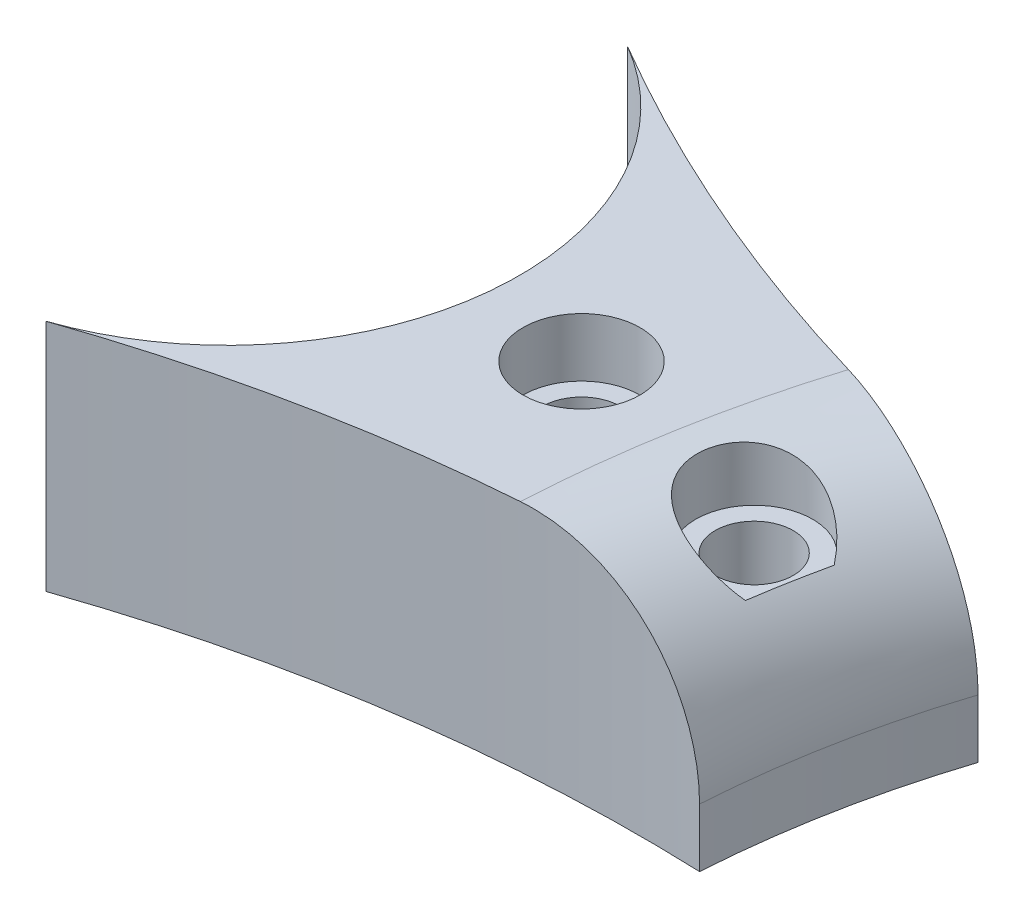
ISO-10303-21;
HEADER;
FILE_DESCRIPTION(('STEP AP214'),'2;1');
FILE_NAME('part.step','',(''),(''),'','','');
FILE_SCHEMA(('AUTOMOTIVE_DESIGN { 1 0 10303 214 1 1 1 1 }'));
ENDSEC;
DATA;
#1=APPLICATION_CONTEXT('core data for automotive mechanical design processes');
#2=APPLICATION_PROTOCOL_DEFINITION('international standard','automotive_design',2000,#1);
#3=PRODUCT_CONTEXT('',#1,'mechanical');
#4=PRODUCT('Part','Part','',(#3));
#5=PRODUCT_RELATED_PRODUCT_CATEGORY('part','',(#4));
#6=PRODUCT_DEFINITION_FORMATION('','',#4);
#7=PRODUCT_DEFINITION_CONTEXT('part definition',#1,'design');
#8=PRODUCT_DEFINITION('design','',#6,#7);
#9=PRODUCT_DEFINITION_SHAPE('','',#8);
#10=(LENGTH_UNIT() NAMED_UNIT(*) SI_UNIT(.MILLI.,.METRE.));
#11=(NAMED_UNIT(*) PLANE_ANGLE_UNIT() SI_UNIT($,.RADIAN.));
#12=(NAMED_UNIT(*) SI_UNIT($,.STERADIAN.) SOLID_ANGLE_UNIT());
#13=UNCERTAINTY_MEASURE_WITH_UNIT(LENGTH_MEASURE(1.E-05),#10,'distance_accuracy_value','');
#14=(GEOMETRIC_REPRESENTATION_CONTEXT(3) GLOBAL_UNCERTAINTY_ASSIGNED_CONTEXT((#13)) GLOBAL_UNIT_ASSIGNED_CONTEXT((#10,
#11,#12)) REPRESENTATION_CONTEXT('',''));
#15=CARTESIAN_POINT('',(0.,0.,0.));
#16=DIRECTION('',(0.,0.,1.));
#17=DIRECTION('',(1.,0.,0.));
#18=AXIS2_PLACEMENT_3D('',#15,#16,#17);
#19=CARTESIAN_POINT('',(-0.236677371726959,12.,1.60597184343372));
#20=DIRECTION('',(0.,-1.,0.));
#21=DIRECTION('',(0.,0.,-1.));
#22=AXIS2_PLACEMENT_3D('',#19,#20,#21);
#23=CYLINDRICAL_SURFACE('',#22,2.);
#24=CARTESIAN_POINT('',(-0.236677371726959,0.,1.60597184343372));
#25=DIRECTION('',(0.,1.,0.));
#26=DIRECTION('',(0.,0.,1.));
#27=AXIS2_PLACEMENT_3D('',#24,#25,#26);
#28=CIRCLE('',#27,2.);
#29=CARTESIAN_POINT('',(-0.236677371726959,0.,3.60597184343373));
#30=VERTEX_POINT('',#29);
#31=EDGE_CURVE('E211',#30,#30,#28,.T.);
#32=ORIENTED_EDGE('',*,*,#31,.F.);
#33=EDGE_LOOP('',(#32));
#34=FACE_BOUND('',#33,.T.);
#35=CARTESIAN_POINT('',(-0.236677371726959,9.,1.60597184343372));
#36=DIRECTION('',(0.,1.,0.));
#37=DIRECTION('',(0.,0.,1.));
#38=AXIS2_PLACEMENT_3D('',#35,#36,#37);
#39=CIRCLE('',#38,2.);
#40=CARTESIAN_POINT('',(-0.236677371726959,9.,3.60597184343373));
#41=VERTEX_POINT('',#40);
#42=EDGE_CURVE('E134',#41,#41,#39,.T.);
#43=ORIENTED_EDGE('',*,*,#42,.T.);
#44=EDGE_LOOP('',(#43));
#45=FACE_BOUND('',#44,.T.);
#46=ADVANCED_FACE('F39',(#34,#45),#23,.F.);
#47=CARTESIAN_POINT('',(9.70418805831716,12.,2.69187906863937));
#48=DIRECTION('',(0.,-1.,0.));
#49=DIRECTION('',(0.,0.,-1.));
#50=AXIS2_PLACEMENT_3D('',#47,#48,#49);
#51=CYLINDRICAL_SURFACE('',#50,2.);
#52=CARTESIAN_POINT('',(9.70418805831716,0.,2.69187906863937));
#53=DIRECTION('',(0.,1.,0.));
#54=DIRECTION('',(0.,0.,1.));
#55=AXIS2_PLACEMENT_3D('',#52,#53,#54);
#56=CIRCLE('',#55,2.);
#57=CARTESIAN_POINT('',(9.70418805831716,0.,4.69187906863937));
#58=VERTEX_POINT('',#57);
#59=EDGE_CURVE('E138',#58,#58,#56,.T.);
#60=ORIENTED_EDGE('',*,*,#59,.F.);
#61=EDGE_LOOP('',(#60));
#62=FACE_BOUND('',#61,.T.);
#63=CARTESIAN_POINT('',(9.70418805831716,9.,2.69187906863937));
#64=DIRECTION('',(0.,1.,0.));
#65=DIRECTION('',(0.,0.,1.));
#66=AXIS2_PLACEMENT_3D('',#63,#64,#65);
#67=CIRCLE('',#66,2.);
#68=CARTESIAN_POINT('',(9.70418805831716,9.,4.69187906863937));
#69=VERTEX_POINT('',#68);
#70=EDGE_CURVE('E130',#69,#69,#67,.T.);
#71=ORIENTED_EDGE('',*,*,#70,.T.);
#72=EDGE_LOOP('',(#71));
#73=FACE_BOUND('',#72,.T.);
#74=ADVANCED_FACE('F184',(#62,#73),#51,.F.);
#75=CARTESIAN_POINT('',(5.9488039499283,12.,-45.8935346301171));
#76=DIRECTION('',(0.,1.,0.));
#77=DIRECTION('',(0.,0.,1.));
#78=AXIS2_PLACEMENT_3D('',#75,#76,#77);
#79=PLANE('',#78);
#80=CARTESIAN_POINT('',(-0.236677371726959,12.,1.60597184343372));
#81=DIRECTION('',(0.,1.,0.));
#82=DIRECTION('',(0.,0.,1.));
#83=AXIS2_PLACEMENT_3D('',#80,#81,#82);
#84=CIRCLE('',#83,3.);
#85=CARTESIAN_POINT('',(-0.236677371726959,12.,4.60597184343372));
#86=VERTEX_POINT('',#85);
#87=EDGE_CURVE('E198',#86,#86,#84,.T.);
#88=ORIENTED_EDGE('',*,*,#87,.F.);
#89=EDGE_LOOP('',(#88));
#90=FACE_BOUND('',#89,.T.);
#91=CARTESIAN_POINT('',(10.3532623870308,12.,89.1808803188708));
#92=DIRECTION('',(0.,-1.,0.));
#93=DIRECTION('',(0.,0.,-1.));
#94=AXIS2_PLACEMENT_3D('',#91,#92,#93);
#95=CIRCLE('',#94,80.);
#96=CARTESIAN_POINT('',(-15.7433670664805,12.,13.5570353282455));
#97=VERTEX_POINT('',#96);
#98=CARTESIAN_POINT('',(4.42791458631752,12.,9.40061801395864));
#99=VERTEX_POINT('',#98);
#100=EDGE_CURVE('E90',#97,#99,#95,.T.);
#101=ORIENTED_EDGE('',*,*,#100,.T.);
#102=CARTESIAN_POINT('',(62.3514658436366,12.,12.3775643925032));
#103=DIRECTION('',(0.,1.,0.));
#104=DIRECTION('',(0.,0.,1.));
#105=AXIS2_PLACEMENT_3D('',#102,#103,#104);
#106=CIRCLE('',#105,58.);
#107=CARTESIAN_POINT('',(6.97531122782223,12.,-4.87008762060925));
#108=VERTEX_POINT('',#107);
#109=EDGE_CURVE('E119',#99,#108,#106,.F.);
#110=ORIENTED_EDGE('',*,*,#109,.T.);
#111=CARTESIAN_POINT('',(32.5340929888705,12.,-91.1646336527375));
#112=DIRECTION('',(0.,-1.,0.));
#113=DIRECTION('',(0.,0.,1.));
#114=AXIS2_PLACEMENT_3D('',#111,#112,#113);
#115=CIRCLE('',#114,90.);
#116=CARTESIAN_POINT('',(-13.0406882207447,12.,-13.5570353282455));
#117=VERTEX_POINT('',#116);
#118=EDGE_CURVE('E103',#108,#117,#115,.T.);
#119=ORIENTED_EDGE('',*,*,#118,.T.);
#120=CARTESIAN_POINT('',(-20.6364850890139,12.,-0.622435607496766));
#121=DIRECTION('',(0.,-1.,0.));
#122=DIRECTION('',(0.,0.,1.));
#123=AXIS2_PLACEMENT_3D('',#120,#121,#122);
#124=CIRCLE('',#123,15.);
#125=EDGE_CURVE('E104',#117,#97,#124,.T.);
#126=ORIENTED_EDGE('',*,*,#125,.T.);
#127=EDGE_LOOP('',(#101,#110,#119,#126));
#128=FACE_BOUND('',#127,.T.);
#129=ADVANCED_FACE('F107',(#90,#128),#79,.T.);
#130=CARTESIAN_POINT('',(5.9488039499283,0.,-45.8935346301171));
#131=DIRECTION('',(0.,1.,0.));
#132=DIRECTION('',(0.,0.,1.));
#133=AXIS2_PLACEMENT_3D('',#130,#131,#132);
#134=PLANE('',#133);
#135=CARTESIAN_POINT('',(-20.6364850890139,0.,-0.622435607496766));
#136=DIRECTION('',(0.,-1.,0.));
#137=DIRECTION('',(0.,0.,1.));
#138=AXIS2_PLACEMENT_3D('',#135,#136,#137);
#139=CIRCLE('',#138,15.);
#140=CARTESIAN_POINT('',(-13.0406882207447,0.,-13.5570353282455));
#141=VERTEX_POINT('',#140);
#142=CARTESIAN_POINT('',(-15.7433670664805,0.,13.5570353282455));
#143=VERTEX_POINT('',#142);
#144=EDGE_CURVE('E117',#141,#143,#139,.T.);
#145=ORIENTED_EDGE('',*,*,#144,.F.);
#146=CARTESIAN_POINT('',(32.5340929888705,0.,-91.1646336527375));
#147=DIRECTION('',(0.,-1.,0.));
#148=DIRECTION('',(0.,0.,1.));
#149=AXIS2_PLACEMENT_3D('',#146,#147,#148);
#150=CIRCLE('',#149,90.);
#151=CARTESIAN_POINT('',(15.7433670664805,0.,-2.74477432804069));
#152=VERTEX_POINT('',#151);
#153=EDGE_CURVE('E113',#152,#141,#150,.T.);
#154=ORIENTED_EDGE('',*,*,#153,.F.);
#155=CARTESIAN_POINT('',(62.3514658436366,0.,12.3775643925032));
#156=DIRECTION('',(0.,-1.,0.));
#157=DIRECTION('',(0.,0.,1.));
#158=AXIS2_PLACEMENT_3D('',#155,#156,#157);
#159=CIRCLE('',#158,49.);
#160=CARTESIAN_POINT('',(13.4519624669639,0.,9.24091498353538));
#161=VERTEX_POINT('',#160);
#162=EDGE_CURVE('E223',#161,#152,#159,.T.);
#163=ORIENTED_EDGE('',*,*,#162,.F.);
#164=CARTESIAN_POINT('',(10.3532623870308,0.,89.1808803188708));
#165=DIRECTION('',(0.,-1.,0.));
#166=DIRECTION('',(0.,0.,-1.));
#167=AXIS2_PLACEMENT_3D('',#164,#165,#166);
#168=CIRCLE('',#167,80.);
#169=EDGE_CURVE('E220',#143,#161,#168,.T.);
#170=ORIENTED_EDGE('',*,*,#169,.F.);
#171=EDGE_LOOP('',(#145,#154,#163,#170));
#172=FACE_BOUND('',#171,.T.);
#173=ORIENTED_EDGE('',*,*,#31,.T.);
#174=EDGE_LOOP('',(#173));
#175=FACE_BOUND('',#174,.T.);
#176=ORIENTED_EDGE('',*,*,#59,.T.);
#177=EDGE_LOOP('',(#176));
#178=FACE_BOUND('',#177,.T.);
#179=ADVANCED_FACE('F157',(#172,#175,#178),#134,.F.);
#180=CARTESIAN_POINT('',(-20.6364850890139,12.,-0.622435607496766));
#181=DIRECTION('',(0.,-1.,0.));
#182=DIRECTION('',(0.,0.,-1.));
#183=AXIS2_PLACEMENT_3D('',#180,#181,#182);
#184=CYLINDRICAL_SURFACE('',#183,15.);
#185=ORIENTED_EDGE('',*,*,#144,.T.);
#186=DIRECTION('',(0.,-1.,0.));
#187=VECTOR('',#186,1.);
#188=CARTESIAN_POINT('',(-15.7433670664805,12.,13.5570353282455));
#189=LINE('',#188,#187);
#190=EDGE_CURVE('E96',#97,#143,#189,.T.);
#191=ORIENTED_EDGE('',*,*,#190,.F.);
#192=ORIENTED_EDGE('',*,*,#125,.F.);
#193=DIRECTION('',(0.,-1.,0.));
#194=VECTOR('',#193,1.);
#195=CARTESIAN_POINT('',(-13.0406882207447,12.,-13.5570353282455));
#196=LINE('',#195,#194);
#197=EDGE_CURVE('E217',#117,#141,#196,.T.);
#198=ORIENTED_EDGE('',*,*,#197,.T.);
#199=EDGE_LOOP('',(#185,#191,#192,#198));
#200=FACE_BOUND('',#199,.T.);
#201=ADVANCED_FACE('F115',(#200),#184,.F.);
#202=CARTESIAN_POINT('',(10.3532623870308,12.,89.1808803188708));
#203=DIRECTION('',(0.,-1.,0.));
#204=DIRECTION('',(0.,0.,-1.));
#205=AXIS2_PLACEMENT_3D('',#202,#203,#204);
#206=CYLINDRICAL_SURFACE('',#205,80.);
#207=DIRECTION('',(0.,-1.,0.));
#208=VECTOR('',#207,1.);
#209=CARTESIAN_POINT('',(13.4519624669639,12.,9.24091498353538));
#210=LINE('',#209,#208);
#211=CARTESIAN_POINT('',(13.4519624669639,3.,9.24091498353538));
#212=VERTEX_POINT('',#211);
#213=EDGE_CURVE('E120',#212,#161,#210,.T.);
#214=ORIENTED_EDGE('',*,*,#213,.F.);
#215=CARTESIAN_POINT('',(13.4519624669639,3.,9.24091498353538));
#216=CARTESIAN_POINT('',(13.4519891234085,3.25297233153846,9.24092505882907));
#217=CARTESIAN_POINT('',(13.4413023460074,3.50594085709848,9.24050205118857));
#218=CARTESIAN_POINT('',(13.3986943509752,4.01006962786932,9.23886267545259));
#219=CARTESIAN_POINT('',(13.3667741036326,4.2612299551778,9.23764634360905));
#220=CARTESIAN_POINT('',(13.2819221523991,4.75978537877782,9.23449424881869));
#221=CARTESIAN_POINT('',(13.2290056087375,5.00718305832853,9.23255900502138));
#222=CARTESIAN_POINT('',(13.1025391292607,5.49663839930236,9.22810985900771));
#223=CARTESIAN_POINT('',(13.0289894544465,5.738696128232,9.22559596411112));
#224=CARTESIAN_POINT('',(12.8617269213555,6.2158721499899,9.22017373643613));
#225=CARTESIAN_POINT('',(12.7680041170434,6.4509869544613,9.21726520935312));
#226=CARTESIAN_POINT('',(12.5610728984253,6.91248301731586,9.21128433454328));
#227=CARTESIAN_POINT('',(12.4478640899602,7.13886409892163,9.20821198350352));
#228=CARTESIAN_POINT('',(12.2027825485956,7.58123279052617,9.20216884549149));
#229=CARTESIAN_POINT('',(12.0709133626762,7.79722236532019,9.19919803935042));
#230=CARTESIAN_POINT('',(11.7894280466629,8.21731375531125,9.19364861622804));
#231=CARTESIAN_POINT('',(11.6398120254271,8.42141564341526,9.19106999684131));
#232=CARTESIAN_POINT('',(11.3240080437077,8.81613795469398,9.18661450212595));
#233=CARTESIAN_POINT('',(11.1578319731109,9.00676788484916,9.18473712784646));
#234=CARTESIAN_POINT('',(10.810004061663,9.37335116934798,9.18199516866419));
#235=CARTESIAN_POINT('',(10.6283522443142,9.54930454597946,9.18113058222335));
#236=CARTESIAN_POINT('',(10.2508447194019,9.88531421402111,9.18072322952118));
#237=CARTESIAN_POINT('',(10.0549868060684,10.0453680275366,9.18118066895999));
#238=CARTESIAN_POINT('',(9.65050509402783,10.3484165732581,9.18371145821867));
#239=CARTESIAN_POINT('',(9.44188149745772,10.4914115754745,9.18578478245807));
#240=CARTESIAN_POINT('',(9.01365761207381,10.7591671085883,9.19181081496272));
#241=CARTESIAN_POINT('',(8.7940723685374,10.8839517579601,9.1957610073555));
#242=CARTESIAN_POINT('',(8.3452584685421,11.1146547512669,9.20576979990807));
#243=CARTESIAN_POINT('',(8.11602995244269,11.2205733696829,9.21182836938941));
#244=CARTESIAN_POINT('',(7.64964888235126,11.4128005176619,9.2262378343115));
#245=CARTESIAN_POINT('',(7.41249918198665,11.499116023733,9.23458791188883));
#246=CARTESIAN_POINT('',(6.93200263272246,11.6516018364655,9.25370818642899));
#247=CARTESIAN_POINT('',(6.68865719373709,11.71777668275,9.26447783707724));
#248=CARTESIAN_POINT('',(6.11228239886847,11.8489561497775,9.29268705958484));
#249=CARTESIAN_POINT('',(5.77735060508964,11.9056361580635,9.31114516588176));
#250=CARTESIAN_POINT('',(5.27242675315383,11.9622717905799,9.34220778177838));
#251=CARTESIAN_POINT('',(5.10378689990107,11.9764196124605,9.35311795654738));
#252=CARTESIAN_POINT('',(4.76607036402424,11.9952823031389,9.37604376332544));
#253=CARTESIAN_POINT('',(4.59699372187056,11.9999980165439,9.38805929625338));
#254=CARTESIAN_POINT('',(4.42791458631752,12.,9.40061801395863));
#255=B_SPLINE_CURVE_WITH_KNOTS('',3,(#215,#216,#217,#218,#219,#220,#221,#222,#223,#224,#225,
#226,#227,#228,#229,#230,#231,#232,#233,#234,#235,#236,#237,#238,#239,#240,#241,#242,#243,#244,
#245,#246,#247,#248,#249,#250,#251,#252,#253,#254),.UNSPECIFIED.,.F.,.F.,(4,2,2,2,2,2,2,2,2,2,2,
2,2,2,2,2,2,2,2,4),(0.,0.758685661945931,1.51733665723845,2.27544086779717,3.0335354890661,
3.79200473629259,4.55048932748373,5.3088299384677,6.0671658980731,6.82496125296062,
7.58275545703803,8.34066757618384,9.09856769735292,9.85545473532678,10.6123307604897,
11.3689369991486,12.1253725753224,13.1434950176361,13.6520230028211,14.1605054493531),.UNSPECIFIED.);
#256=EDGE_CURVE('E49',#212,#99,#255,.T.);
#257=ORIENTED_EDGE('',*,*,#256,.T.);
#258=ORIENTED_EDGE('',*,*,#100,.F.);
#259=ORIENTED_EDGE('',*,*,#190,.T.);
#260=ORIENTED_EDGE('',*,*,#169,.T.);
#261=EDGE_LOOP('',(#214,#257,#258,#259,#260));
#262=FACE_BOUND('',#261,.T.);
#263=ADVANCED_FACE('F93',(#262),#206,.F.);
#264=CARTESIAN_POINT('',(62.3514658436366,12.,12.3775643925032));
#265=DIRECTION('',(0.,-1.,0.));
#266=DIRECTION('',(0.,0.,-1.));
#267=AXIS2_PLACEMENT_3D('',#264,#265,#266);
#268=CYLINDRICAL_SURFACE('',#267,49.);
#269=DIRECTION('',(0.,-1.,0.));
#270=VECTOR('',#269,1.);
#271=CARTESIAN_POINT('',(15.7433670664805,12.,-2.74477432804069));
#272=LINE('',#271,#270);
#273=CARTESIAN_POINT('',(15.7433670664805,3.,-2.74477432804069));
#274=VERTEX_POINT('',#273);
#275=EDGE_CURVE('E126',#274,#152,#272,.T.);
#276=ORIENTED_EDGE('',*,*,#275,.F.);
#277=CARTESIAN_POINT('',(62.3514658436366,3.,12.3775643925032));
#278=DIRECTION('',(0.,1.,0.));
#279=DIRECTION('',(0.,0.,1.));
#280=AXIS2_PLACEMENT_3D('',#277,#278,#279);
#281=CIRCLE('',#280,49.);
#282=EDGE_CURVE('E147',#274,#212,#281,.T.);
#283=ORIENTED_EDGE('',*,*,#282,.T.);
#284=ORIENTED_EDGE('',*,*,#213,.T.);
#285=ORIENTED_EDGE('',*,*,#162,.T.);
#286=EDGE_LOOP('',(#276,#283,#284,#285));
#287=FACE_BOUND('',#286,.T.);
#288=ADVANCED_FACE('F155',(#287),#268,.F.);
#289=CARTESIAN_POINT('',(32.5340929888705,12.,-91.1646336527375));
#290=DIRECTION('',(0.,-1.,0.));
#291=DIRECTION('',(0.,0.,-1.));
#292=AXIS2_PLACEMENT_3D('',#289,#290,#291);
#293=CYLINDRICAL_SURFACE('',#292,90.);
#294=ORIENTED_EDGE('',*,*,#118,.F.);
#295=CARTESIAN_POINT('',(6.97531122782223,12.,-4.87008762060924));
#296=CARTESIAN_POINT('',(7.21769706903817,12.0000280066762,-4.79828643563821));
#297=CARTESIAN_POINT('',(7.46038600866378,11.9893522366982,-4.72752827402733));
#298=CARTESIAN_POINT('',(7.94460822047395,11.9468041332819,-4.58853899914157));
#299=CARTESIAN_POINT('',(8.18614157638992,11.9149333597589,-4.52030770028412));
#300=CARTESIAN_POINT('',(8.66608512226214,11.8302488501873,-4.38686968994159));
#301=CARTESIAN_POINT('',(8.90449821285437,11.777456240279,-4.32166000130162));
#302=CARTESIAN_POINT('',(9.37672507801123,11.6513297322181,-4.19454645275531));
#303=CARTESIAN_POINT('',(9.61053888165769,11.5779959639943,-4.13264257194172));
#304=CARTESIAN_POINT('',(10.0719558079063,11.4112942036636,-4.0124146962508));
#305=CARTESIAN_POINT('',(10.2995567599592,11.3179193083694,-3.95409194382192));
#306=CARTESIAN_POINT('',(10.7468186442552,11.1118256603236,-3.84128124984659));
#307=CARTESIAN_POINT('',(10.966479373241,10.9991064128106,-3.78679340643407));
#308=CARTESIAN_POINT('',(11.3962384579735,10.7551448551662,-3.68183513094993));
#309=CARTESIAN_POINT('',(11.6063377030206,10.6239042723542,-3.63136432493086));
#310=CARTESIAN_POINT('',(12.0154643533732,10.3438228655839,-3.53455847078431));
#311=CARTESIAN_POINT('',(12.214491777892,10.1949820721691,-3.48822341547989));
#312=CARTESIAN_POINT('',(12.6007793815406,9.88012476415672,-3.39959254708856));
#313=CARTESIAN_POINT('',(12.7879900818753,9.7140428562925,-3.35731337656452));
#314=CARTESIAN_POINT('',(13.1483942816105,9.36635906463955,-3.27704192964803));
#315=CARTESIAN_POINT('',(13.3215877591503,9.18475715664746,-3.23904965994119));
#316=CARTESIAN_POINT('',(13.6526927924775,8.80726485100442,-3.1673528170209));
#317=CARTESIAN_POINT('',(13.8106012342332,8.61137155595486,-3.13364911708288));
#318=CARTESIAN_POINT('',(14.109895237508,8.206701203607,-3.07052297375017));
#319=CARTESIAN_POINT('',(14.2512810539191,7.99792434513735,-3.04110046430852));
#320=CARTESIAN_POINT('',(14.5167219038542,7.56849490334303,-2.98644616653497));
#321=CARTESIAN_POINT('',(14.6407400768558,7.34781839845146,-2.9612232705294));
#322=CARTESIAN_POINT('',(14.8701177233749,6.8965562805896,-2.91500095297175));
#323=CARTESIAN_POINT('',(14.9754776026978,6.66597088326671,-2.89400143956256));
#324=CARTESIAN_POINT('',(15.1666530162495,6.19663208188723,-2.85618823477628));
#325=CARTESIAN_POINT('',(15.252478583148,5.95788294346816,-2.83937239428256));
#326=CARTESIAN_POINT('',(15.4039376670397,5.47391607367791,-2.80987310840727));
#327=CARTESIAN_POINT('',(15.4695761852337,5.22869996082621,-2.79718863946113));
#328=CARTESIAN_POINT('',(15.597389298084,4.65617545740467,-2.77258847065238));
#329=CARTESIAN_POINT('',(15.6521149451569,4.3270905993827,-2.76214321739885));
#330=CARTESIAN_POINT('',(15.7068522674228,3.83073638544227,-2.75171459782211));
#331=CARTESIAN_POINT('',(15.7205395014008,3.66490318326629,-2.74911159609403));
#332=CARTESIAN_POINT('',(15.7387961009767,3.33272719036352,-2.74564217636784));
#333=CARTESIAN_POINT('',(15.7433659981163,3.16638442991033,-2.74477565713262));
#334=CARTESIAN_POINT('',(15.7433670664805,3.,-2.74477432804068));
#335=B_SPLINE_CURVE_WITH_KNOTS('',3,(#295,#296,#297,#298,#299,#300,#301,#302,#303,#304,#305,
#306,#307,#308,#309,#310,#311,#312,#313,#314,#315,#316,#317,#318,#319,#320,#321,#322,#323,#324,
#325,#326,#327,#328,#329,#330,#331,#332,#333,#334),.UNSPECIFIED.,.F.,.F.,(4,2,2,2,2,2,2,2,2,2,2,
2,2,2,2,2,2,2,2,4),(0.,0.758155194934632,1.51625459714337,2.27359043957125,3.03092149173646,
3.78851382723067,4.54612554219338,5.30366664812074,6.06120643942804,6.82173242726662,
7.58225960116267,8.34294139314578,9.10361144866087,9.86587222132229,10.6281164132819,
11.3899682347469,12.151631160402,13.1505672371017,13.64960153805,14.1486067443979),.UNSPECIFIED.);
#336=EDGE_CURVE('E124',#108,#274,#335,.T.);
#337=ORIENTED_EDGE('',*,*,#336,.T.);
#338=ORIENTED_EDGE('',*,*,#275,.T.);
#339=ORIENTED_EDGE('',*,*,#153,.T.);
#340=ORIENTED_EDGE('',*,*,#197,.F.);
#341=EDGE_LOOP('',(#294,#337,#338,#339,#340));
#342=FACE_BOUND('',#341,.T.);
#343=ADVANCED_FACE('F149',(#342),#293,.F.);
#344=CARTESIAN_POINT('',(9.70418805831716,9.,2.69187906863937));
#345=DIRECTION('',(0.,1.,0.));
#346=DIRECTION('',(0.,0.,1.));
#347=AXIS2_PLACEMENT_3D('',#344,#345,#346);
#348=CYLINDRICAL_SURFACE('',#347,3.);
#349=CARTESIAN_POINT('',(9.40578714008849,11.2662975058842,-0.29324352381815));
#350=CARTESIAN_POINT('',(9.25049215440643,11.3297740442479,-0.277719364470941));
#351=CARTESIAN_POINT('',(9.09416849417277,11.3877530236726,-0.249811188231789));
#352=CARTESIAN_POINT('',(8.78447600134041,11.4924234448911,-0.168147763440816));
#353=CARTESIAN_POINT('',(8.63110681214118,11.5391162568655,-0.114395654804367));
#354=CARTESIAN_POINT('',(8.33253377727357,11.6217367131094,0.0188045365195675));
#355=CARTESIAN_POINT('',(8.18734294952403,11.657647567817,0.0982922986385763));
#356=CARTESIAN_POINT('',(7.91066527778586,11.7197375095947,0.281321112780464));
#357=CARTESIAN_POINT('',(7.77917939271275,11.7459159160276,0.384863846261353));
#358=CARTESIAN_POINT('',(7.53752616407643,11.7895165003453,0.610472310266735));
#359=CARTESIAN_POINT('',(7.42692403155027,11.8071331893858,0.732035600086029));
#360=CARTESIAN_POINT('',(7.22677570742747,11.8359705997607,0.99207056688168));
#361=CARTESIAN_POINT('',(7.13722934589435,11.8471913727161,1.13054210738158));
#362=CARTESIAN_POINT('',(6.9816258831559,11.8644713425305,1.42108446525319));
#363=CARTESIAN_POINT('',(6.91566013386089,11.8705105897862,1.57320537526647));
#364=CARTESIAN_POINT('',(6.80963832211401,11.8781304682516,1.8863312822556));
#365=CARTESIAN_POINT('',(6.76958335813525,11.8797109104423,2.04733665556926));
#366=CARTESIAN_POINT('',(6.71634554292891,11.8786294739447,2.37484973313));
#367=CARTESIAN_POINT('',(6.70334792937794,11.8759385725069,2.54138748740537));
#368=CARTESIAN_POINT('',(6.70511250504986,11.8658846588736,2.87417955444778));
#369=CARTESIAN_POINT('',(6.71987506880934,11.8585215836426,3.04043386336032));
#370=CARTESIAN_POINT('',(6.7766199372141,11.8382005419006,3.36785428136127));
#371=CARTESIAN_POINT('',(6.81859731864207,11.8252435874757,3.52902130522118));
#372=CARTESIAN_POINT('',(6.92829318781732,11.7924052232865,3.84158878604553));
#373=CARTESIAN_POINT('',(6.99600937659056,11.7725244319683,3.99299011386346));
#374=CARTESIAN_POINT('',(7.15412380538224,11.7245065480765,4.28055740844003));
#375=CARTESIAN_POINT('',(7.2443547987384,11.6964300851335,4.41682545589645));
#376=CARTESIAN_POINT('',(7.44429210283542,11.6306203493756,4.6715455003005));
#377=CARTESIAN_POINT('',(7.55399595438271,11.5928882956831,4.78999974343739));
#378=CARTESIAN_POINT('',(7.78824045494661,11.5069738879896,5.00584498425056));
#379=CARTESIAN_POINT('',(7.91273560685804,11.4588232240495,5.10329810475817));
#380=CARTESIAN_POINT('',(8.17208665810568,11.3517409468312,5.2758568943428));
#381=CARTESIAN_POINT('',(8.30694338246959,11.2928084745475,5.35096078156414));
#382=CARTESIAN_POINT('',(8.58743930730873,11.1622052767132,5.48072075689383));
#383=CARTESIAN_POINT('',(8.73329295354231,11.0901427075928,5.53451370772446));
#384=CARTESIAN_POINT('',(9.02650055191829,10.936003561803,5.61831501475694));
#385=CARTESIAN_POINT('',(9.17385522938129,10.8539219106976,5.64831126031308));
#386=CARTESIAN_POINT('',(9.48290824561059,10.6715531742277,5.68820735386878));
#387=CARTESIAN_POINT('',(9.64434699511061,10.5702569547786,5.69545491619812));
#388=CARTESIAN_POINT('',(9.96090565125076,10.3596654226711,5.6850723206547));
#389=CARTESIAN_POINT('',(10.1160253938538,10.250369902562,5.66744151737939));
#390=CARTESIAN_POINT('',(10.4453775662694,10.0057517579067,5.60455259529073));
#391=CARTESIAN_POINT('',(10.6179279354259,9.86932076767589,5.55483763515861));
#392=CARTESIAN_POINT('',(10.9496755228863,9.59248949590656,5.42693246548917));
#393=CARTESIAN_POINT('',(11.1088272115159,9.45207768942016,5.34864963498194));
#394=CARTESIAN_POINT('',(11.3500113463556,9.22986636655757,5.20230680678652));
#395=CARTESIAN_POINT('',(11.4370230058066,9.14751849457436,5.14309944509145));
#396=CARTESIAN_POINT('',(11.6055441824483,8.98467163071971,5.01482409290237));
#397=CARTESIAN_POINT('',(11.6870499044256,8.90417393888241,4.94574940102938));
#398=CARTESIAN_POINT('',(11.8437216305141,8.74728375794119,4.79757938095961));
#399=CARTESIAN_POINT('',(11.9189146723647,8.67087432934431,4.71853084735238));
#400=CARTESIAN_POINT('',(12.0625924292676,8.52444855712732,4.54935821107423));
#401=CARTESIAN_POINT('',(12.1310878713809,8.45442200314036,4.45925235804838));
#402=CARTESIAN_POINT('',(12.2495252423369,8.33527766254284,4.28266492573942));
#403=CARTESIAN_POINT('',(12.3006622943538,8.28461717655401,4.19804757320805));
#404=CARTESIAN_POINT('',(12.3961550792466,8.19362662088828,4.01985753920998));
#405=CARTESIAN_POINT('',(12.4405166956936,8.15328756761418,3.92629274357097));
#406=CARTESIAN_POINT('',(12.5212055070826,8.08649656252731,3.72910516006645));
#407=CARTESIAN_POINT('',(12.5574136888469,8.06024343250282,3.62536164088127));
#408=CARTESIAN_POINT('',(12.6033183491311,8.03490966625571,3.46527751780859));
#409=CARTESIAN_POINT('',(12.6172160082503,8.02880581886806,3.41118658399621));
#410=CARTESIAN_POINT('',(12.6420243779302,8.0214970958414,3.30200274729493));
#411=CARTESIAN_POINT('',(12.6529355516817,8.02029146010901,3.24691000119789));
#412=CARTESIAN_POINT('',(12.678343694622,8.02382061588998,3.09643986537997));
#413=CARTESIAN_POINT('',(12.6897699214331,8.03345508676163,3.00060525675223));
#414=CARTESIAN_POINT('',(12.7033567473697,8.06626542101068,2.81065837124299));
#415=CARTESIAN_POINT('',(12.7055065375858,8.08945704549968,2.71654823072627));
#416=CARTESIAN_POINT('',(12.7006176377297,8.15685411127997,2.49969690406062));
#417=CARTESIAN_POINT('',(12.6901000000825,8.20557324911873,2.37846205610796));
#418=CARTESIAN_POINT('',(12.6561725003545,8.31657438097196,2.1442577610368));
#419=CARTESIAN_POINT('',(12.6327269282614,8.3788936523653,2.03131219449383));
#420=CARTESIAN_POINT('',(12.5803073131016,8.4998652252789,1.83376852797409));
#421=CARTESIAN_POINT('',(12.5531443772757,8.55708223831103,1.74777846822001));
#422=CARTESIAN_POINT('',(12.4923160144699,8.67546739171819,1.58091741032779));
#423=CARTESIAN_POINT('',(12.4586464594706,8.7366380239182,1.50004970546188));
#424=CARTESIAN_POINT('',(12.3852827184797,8.86161488428815,1.3430858855139));
#425=CARTESIAN_POINT('',(12.3455813414632,8.92542419125438,1.2669956211034));
#426=CARTESIAN_POINT('',(12.2605185508112,9.05459258605039,1.11948582667149));
#427=CARTESIAN_POINT('',(12.2151582769275,9.1199513596629,1.04806536051382));
#428=CARTESIAN_POINT('',(12.1159272925599,9.25561568007331,0.905392498310775));
#429=CARTESIAN_POINT('',(12.0616996938309,9.3259725547955,0.834436686381756));
#430=CARTESIAN_POINT('',(11.9472134306144,9.46681795550061,0.697690726270198));
#431=CARTESIAN_POINT('',(11.886952869725,9.53730651600159,0.631902214047372));
#432=CARTESIAN_POINT('',(11.6973918274784,9.74783266722437,0.442648408092192));
#433=CARTESIAN_POINT('',(11.5591631325299,9.88713736704758,0.327080993729898));
#434=CARTESIAN_POINT('',(11.2614406431543,10.1574472640098,0.121425485428226));
#435=CARTESIAN_POINT('',(11.1022230170639,10.288532213169,0.0310472822387959));
#436=CARTESIAN_POINT('',(10.8479639314993,10.477057820486,-0.0830811060406653));
#437=CARTESIAN_POINT('',(10.7606306530672,10.5385543075221,-0.117552783682636));
#438=CARTESIAN_POINT('',(10.5811905690535,10.6583833130494,-0.178635383603333));
#439=CARTESIAN_POINT('',(10.4890846287269,10.7167164011485,-0.205247724912388));
#440=CARTESIAN_POINT('',(10.239024977883,10.8666518100828,-0.264392365804533));
#441=CARTESIAN_POINT('',(10.0773118234025,10.9551332945173,-0.289461549032111));
#442=CARTESIAN_POINT('',(9.74607146603392,11.1200511670651,-0.312410532427505));
#443=CARTESIAN_POINT('',(9.57655121104712,11.1964980075054,-0.310314059847995));
#444=CARTESIAN_POINT('',(9.40578714008849,11.2662975058842,-0.29324352381815));
#445=B_SPLINE_CURVE_WITH_KNOTS('',3,(#349,#350,#351,#352,#353,#354,#355,#356,#357,#358,#359,
#360,#361,#362,#363,#364,#365,#366,#367,#368,#369,#370,#371,#372,#373,#374,#375,#376,#377,#378,
#379,#380,#381,#382,#383,#384,#385,#386,#387,#388,#389,#390,#391,#392,#393,#394,#395,#396,#397,
#398,#399,#400,#401,#402,#403,#404,#405,#406,#407,#408,#409,#410,#411,#412,#413,#414,#415,#416,
#417,#418,#419,#420,#421,#422,#423,#424,#425,#426,#427,#428,#429,#430,#431,#432,#433,#434,#435,
#436,#437,#438,#439,#440,#441,#442,#443,#444),.UNSPECIFIED.,.T.,.F.,(4,2,2,2,2,2,2,2,2,2,2,2,2,
2,2,2,2,2,2,2,2,2,2,2,2,2,2,2,2,2,2,2,2,2,2,2,2,2,2,2,2,2,2,2,2,2,2,4),(0.,0.504879628898823,
1.00969793280867,1.51529830587579,2.02093403137439,2.51447221629304,3.00800641783725,
3.50343237619833,3.99887933648689,4.49770717516493,4.99654174400947,5.49528609780995,
5.99398591454384,6.48908612368997,6.98412385191467,7.47767648682363,7.97126846107298,
8.48319451311987,8.99538092830974,9.56541335533654,10.1354605705994,10.8095971467713,
11.4859390715792,11.8864308399108,12.287195906158,12.6861461227971,13.0844465278003,
13.4168887171162,13.7490405625642,14.0857649783617,14.2540361010917,14.4222811108925,
14.7116092712486,15.0012744660698,15.3923124609797,15.7844360458604,16.1044062516026,
16.4245801276937,16.7451387485089,17.0656329099063,17.4064063926109,17.747287332439,
18.4280602218936,19.1006338741045,19.4369783276584,19.7732620158796,20.3289184913316,
20.8840896734286),.UNSPECIFIED.);
#446=CARTESIAN_POINT('',(12.2964515565136,9.,1.18185590460561));
#447=VERTEX_POINT('',#446);
#448=CARTESIAN_POINT('',(11.5893022758446,8.99999999999997,5.02561949698095));
#449=VERTEX_POINT('',#448);
#450=EDGE_CURVE('E169',#447,#449,#445,.T.);
#451=ORIENTED_EDGE('',*,*,#450,.T.);
#452=CARTESIAN_POINT('',(9.70418805831716,9.,2.69187906863937));
#453=DIRECTION('',(0.,1.,0.));
#454=DIRECTION('',(0.,0.,1.));
#455=AXIS2_PLACEMENT_3D('',#452,#453,#454);
#456=CIRCLE('',#455,3.);
#457=EDGE_CURVE('E176',#447,#449,#456,.T.);
#458=ORIENTED_EDGE('',*,*,#457,.F.);
#459=EDGE_LOOP('',(#451,#458));
#460=FACE_BOUND('',#459,.T.);
#461=ADVANCED_FACE('F154',(#460),#348,.F.);
#462=CARTESIAN_POINT('',(9.70418805831716,9.,2.69187906863937));
#463=DIRECTION('',(0.,1.,0.));
#464=DIRECTION('',(0.,0.,1.));
#465=AXIS2_PLACEMENT_3D('',#462,#463,#464);
#466=PLANE('',#465);
#467=ORIENTED_EDGE('',*,*,#70,.F.);
#468=EDGE_LOOP('',(#467));
#469=FACE_BOUND('',#468,.T.);
#470=ORIENTED_EDGE('',*,*,#457,.T.);
#471=CARTESIAN_POINT('',(62.3514658436366,9.,12.3775643925032));
#472=DIRECTION('',(0.,-1.,0.));
#473=DIRECTION('',(0.,0.,-1.));
#474=AXIS2_PLACEMENT_3D('',#471,#472,#473);
#475=CIRCLE('',#474,51.2917960675006);
#476=EDGE_CURVE('E11',#449,#447,#475,.T.);
#477=ORIENTED_EDGE('',*,*,#476,.T.);
#478=EDGE_LOOP('',(#470,#477));
#479=FACE_BOUND('',#478,.T.);
#480=ADVANCED_FACE('F181',(#469,#479),#466,.T.);
#481=CARTESIAN_POINT('',(-0.236677371726959,9.,1.60597184343372));
#482=DIRECTION('',(0.,1.,0.));
#483=DIRECTION('',(0.,0.,1.));
#484=AXIS2_PLACEMENT_3D('',#481,#482,#483);
#485=CYLINDRICAL_SURFACE('',#484,3.);
#486=CARTESIAN_POINT('',(-0.236677371726959,9.,1.60597184343372));
#487=DIRECTION('',(0.,1.,0.));
#488=DIRECTION('',(0.,0.,1.));
#489=AXIS2_PLACEMENT_3D('',#486,#487,#488);
#490=CIRCLE('',#489,3.);
#491=CARTESIAN_POINT('',(-0.236677371726959,9.,4.60597184343372));
#492=VERTEX_POINT('',#491);
#493=EDGE_CURVE('E135',#492,#492,#490,.T.);
#494=ORIENTED_EDGE('',*,*,#493,.F.);
#495=EDGE_LOOP('',(#494));
#496=FACE_BOUND('',#495,.T.);
#497=ORIENTED_EDGE('',*,*,#87,.T.);
#498=EDGE_LOOP('',(#497));
#499=FACE_BOUND('',#498,.T.);
#500=ADVANCED_FACE('F241',(#496,#499),#485,.F.);
#501=CARTESIAN_POINT('',(-0.236677371726959,9.,1.60597184343372));
#502=DIRECTION('',(0.,1.,0.));
#503=DIRECTION('',(0.,0.,1.));
#504=AXIS2_PLACEMENT_3D('',#501,#502,#503);
#505=PLANE('',#504);
#506=ORIENTED_EDGE('',*,*,#42,.F.);
#507=EDGE_LOOP('',(#506));
#508=FACE_BOUND('',#507,.T.);
#509=ORIENTED_EDGE('',*,*,#493,.T.);
#510=EDGE_LOOP('',(#509));
#511=FACE_BOUND('',#510,.T.);
#512=ADVANCED_FACE('F239',(#508,#511),#505,.T.);
#513=CARTESIAN_POINT('',(62.3514658436366,3.,12.3775643925032));
#514=DIRECTION('',(0.,1.,0.));
#515=DIRECTION('',(0.,0.,1.));
#516=AXIS2_PLACEMENT_3D('',#513,#514,#515);
#517=TOROIDAL_SURFACE('',#516,58.,9.);
#518=ORIENTED_EDGE('',*,*,#256,.F.);
#519=ORIENTED_EDGE('',*,*,#282,.F.);
#520=ORIENTED_EDGE('',*,*,#336,.F.);
#521=ORIENTED_EDGE('',*,*,#109,.F.);
#522=EDGE_LOOP('',(#518,#519,#520,#521));
#523=FACE_BOUND('',#522,.T.);
#524=ORIENTED_EDGE('',*,*,#450,.F.);
#525=ORIENTED_EDGE('',*,*,#476,.F.);
#526=EDGE_LOOP('',(#524,#525));
#527=FACE_BOUND('',#526,.T.);
#528=ADVANCED_FACE('F41',(#523,#527),#517,.T.);
#529=CLOSED_SHELL('',(#46,#74,#129,#179,#201,#263,#288,#343,#461,#480,#500,#512,#528));
#530=MANIFOLD_SOLID_BREP('B2',#529);
#531=ADVANCED_BREP_SHAPE_REPRESENTATION('',(#18,#530),#14);
#532=SHAPE_DEFINITION_REPRESENTATION(#9,#531);
ENDSEC;
END-ISO-10303-21;
